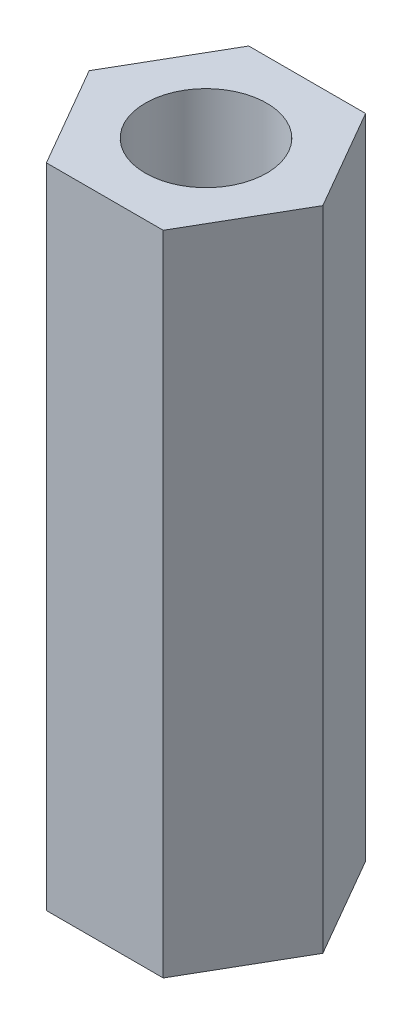
ISO-10303-21;
HEADER;
FILE_DESCRIPTION(('STEP AP214'),'2;1');
FILE_NAME('part.step','',(''),(''),'','','');
FILE_SCHEMA(('AUTOMOTIVE_DESIGN { 1 0 10303 214 1 1 1 1 }'));
ENDSEC;
DATA;
#1=APPLICATION_CONTEXT('core data for automotive mechanical design processes');
#2=APPLICATION_PROTOCOL_DEFINITION('international standard','automotive_design',2000,#1);
#3=PRODUCT_CONTEXT('',#1,'mechanical');
#4=PRODUCT('Part','Part','',(#3));
#5=PRODUCT_RELATED_PRODUCT_CATEGORY('part','',(#4));
#6=PRODUCT_DEFINITION_FORMATION('','',#4);
#7=PRODUCT_DEFINITION_CONTEXT('part definition',#1,'design');
#8=PRODUCT_DEFINITION('design','',#6,#7);
#9=PRODUCT_DEFINITION_SHAPE('','',#8);
#10=(LENGTH_UNIT() NAMED_UNIT(*) SI_UNIT(.MILLI.,.METRE.));
#11=(NAMED_UNIT(*) PLANE_ANGLE_UNIT() SI_UNIT($,.RADIAN.));
#12=(NAMED_UNIT(*) SI_UNIT($,.STERADIAN.) SOLID_ANGLE_UNIT());
#13=UNCERTAINTY_MEASURE_WITH_UNIT(LENGTH_MEASURE(1.E-05),#10,'distance_accuracy_value','');
#14=(GEOMETRIC_REPRESENTATION_CONTEXT(3) GLOBAL_UNCERTAINTY_ASSIGNED_CONTEXT((#13)) GLOBAL_UNIT_ASSIGNED_CONTEXT((#10,
#11,#12)) REPRESENTATION_CONTEXT('',''));
#15=CARTESIAN_POINT('',(0.,0.,0.));
#16=DIRECTION('',(0.,0.,1.));
#17=DIRECTION('',(1.,0.,0.));
#18=AXIS2_PLACEMENT_3D('',#15,#16,#17);
#19=CARTESIAN_POINT('',(0.,-6.,0.));
#20=DIRECTION('',(0.,1.,0.));
#21=DIRECTION('',(0.,0.,1.));
#22=AXIS2_PLACEMENT_3D('',#19,#20,#21);
#23=PLANE('',#22);
#24=DIRECTION('',(1.,0.,0.));
#25=VECTOR('',#24,1.);
#26=CARTESIAN_POINT('',(-1.44337567297405,-6.,2.5));
#27=LINE('',#26,#25);
#28=CARTESIAN_POINT('',(-1.44337567297405,-6.,2.5));
#29=VERTEX_POINT('',#28);
#30=CARTESIAN_POINT('',(1.44337567297408,-6.,2.5));
#31=VERTEX_POINT('',#30);
#32=EDGE_CURVE('E123',#29,#31,#27,.T.);
#33=ORIENTED_EDGE('',*,*,#32,.F.);
#34=DIRECTION('',(0.5,0.,0.866025403784438));
#35=VECTOR('',#34,1.);
#36=CARTESIAN_POINT('',(-2.88675134594812,-6.,0.));
#37=LINE('',#36,#35);
#38=CARTESIAN_POINT('',(-2.88675134594812,-6.,0.));
#39=VERTEX_POINT('',#38);
#40=EDGE_CURVE('E48',#39,#29,#37,.T.);
#41=ORIENTED_EDGE('',*,*,#40,.F.);
#42=DIRECTION('',(-0.5,0.,0.866025403784438));
#43=VECTOR('',#42,1.);
#44=CARTESIAN_POINT('',(-1.44337567297405,-6.,-2.50000000000001));
#45=LINE('',#44,#43);
#46=CARTESIAN_POINT('',(-1.44337567297405,-6.,-2.50000000000001));
#47=VERTEX_POINT('',#46);
#48=EDGE_CURVE('E56',#47,#39,#45,.T.);
#49=ORIENTED_EDGE('',*,*,#48,.F.);
#50=DIRECTION('',(-1.,0.,0.));
#51=VECTOR('',#50,1.);
#52=CARTESIAN_POINT('',(1.44337567297408,-6.,-2.50000000000001));
#53=LINE('',#52,#51);
#54=CARTESIAN_POINT('',(1.44337567297408,-6.,-2.50000000000001));
#55=VERTEX_POINT('',#54);
#56=EDGE_CURVE('E129',#55,#47,#53,.T.);
#57=ORIENTED_EDGE('',*,*,#56,.F.);
#58=DIRECTION('',(-0.500000000000001,0.,-0.866025403784438));
#59=VECTOR('',#58,1.);
#60=CARTESIAN_POINT('',(2.88675134594815,-6.,0.));
#61=LINE('',#60,#59);
#62=CARTESIAN_POINT('',(2.88675134594815,-6.,0.));
#63=VERTEX_POINT('',#62);
#64=EDGE_CURVE('E127',#63,#55,#61,.T.);
#65=ORIENTED_EDGE('',*,*,#64,.F.);
#66=DIRECTION('',(0.500000000000001,0.,-0.866025403784438));
#67=VECTOR('',#66,1.);
#68=CARTESIAN_POINT('',(1.44337567297408,-6.,2.5));
#69=LINE('',#68,#67);
#70=EDGE_CURVE('E125',#31,#63,#69,.T.);
#71=ORIENTED_EDGE('',*,*,#70,.F.);
#72=EDGE_LOOP('',(#33,#41,#49,#57,#65,#71));
#73=FACE_BOUND('',#72,.T.);
#74=CARTESIAN_POINT('',(0.,-6.,0.));
#75=DIRECTION('',(0.,1.,0.));
#76=DIRECTION('',(0.,0.,1.));
#77=AXIS2_PLACEMENT_3D('',#74,#75,#76);
#78=CIRCLE('',#77,1.5);
#79=CARTESIAN_POINT('',(0.,-6.,1.5));
#80=VERTEX_POINT('',#79);
#81=EDGE_CURVE('E120',#80,#80,#78,.T.);
#82=ORIENTED_EDGE('',*,*,#81,.T.);
#83=EDGE_LOOP('',(#82));
#84=FACE_BOUND('',#83,.T.);
#85=ADVANCED_FACE('F33',(#73,#84),#23,.F.);
#86=CARTESIAN_POINT('',(-1.44337567297405,6.,2.5));
#87=DIRECTION('',(0.,0.,-1.));
#88=DIRECTION('',(-1.,0.,0.));
#89=AXIS2_PLACEMENT_3D('',#86,#87,#88);
#90=PLANE('',#89);
#91=ORIENTED_EDGE('',*,*,#32,.T.);
#92=DIRECTION('',(0.,-1.,0.));
#93=VECTOR('',#92,1.);
#94=CARTESIAN_POINT('',(1.44337567297408,6.,2.5));
#95=LINE('',#94,#93);
#96=CARTESIAN_POINT('',(1.44337567297408,10.,2.5));
#97=VERTEX_POINT('',#96);
#98=EDGE_CURVE('E11',#97,#31,#95,.T.);
#99=ORIENTED_EDGE('',*,*,#98,.F.);
#100=DIRECTION('',(1.,0.,0.));
#101=VECTOR('',#100,1.);
#102=CARTESIAN_POINT('',(-1.44337567297405,10.,2.5));
#103=LINE('',#102,#101);
#104=CARTESIAN_POINT('',(-1.44337567297405,10.,2.5));
#105=VERTEX_POINT('',#104);
#106=EDGE_CURVE('E96',#105,#97,#103,.T.);
#107=ORIENTED_EDGE('',*,*,#106,.F.);
#108=DIRECTION('',(0.,-1.,0.));
#109=VECTOR('',#108,1.);
#110=CARTESIAN_POINT('',(-1.44337567297405,6.,2.5));
#111=LINE('',#110,#109);
#112=EDGE_CURVE('E85',#105,#29,#111,.T.);
#113=ORIENTED_EDGE('',*,*,#112,.T.);
#114=EDGE_LOOP('',(#91,#99,#107,#113));
#115=FACE_BOUND('',#114,.T.);
#116=ADVANCED_FACE('F35',(#115),#90,.F.);
#117=CARTESIAN_POINT('',(1.44337567297408,6.,2.5));
#118=DIRECTION('',(-0.866025403784438,0.,-0.500000000000001));
#119=DIRECTION('',(-0.500000000000001,0.,0.866025403784438));
#120=AXIS2_PLACEMENT_3D('',#117,#118,#119);
#121=PLANE('',#120);
#122=ORIENTED_EDGE('',*,*,#70,.T.);
#123=DIRECTION('',(0.,-1.,0.));
#124=VECTOR('',#123,1.);
#125=CARTESIAN_POINT('',(2.88675134594815,6.,0.));
#126=LINE('',#125,#124);
#127=CARTESIAN_POINT('',(2.88675134594815,10.,0.));
#128=VERTEX_POINT('',#127);
#129=EDGE_CURVE('E41',#128,#63,#126,.T.);
#130=ORIENTED_EDGE('',*,*,#129,.F.);
#131=DIRECTION('',(0.500000000000001,0.,-0.866025403784438));
#132=VECTOR('',#131,1.);
#133=CARTESIAN_POINT('',(1.44337567297408,10.,2.5));
#134=LINE('',#133,#132);
#135=EDGE_CURVE('E100',#97,#128,#134,.T.);
#136=ORIENTED_EDGE('',*,*,#135,.F.);
#137=ORIENTED_EDGE('',*,*,#98,.T.);
#138=EDGE_LOOP('',(#122,#130,#136,#137));
#139=FACE_BOUND('',#138,.T.);
#140=ADVANCED_FACE('F165',(#139),#121,.F.);
#141=CARTESIAN_POINT('',(2.88675134594815,6.,0.));
#142=DIRECTION('',(-0.866025403784438,0.,0.500000000000001));
#143=DIRECTION('',(0.500000000000001,0.,0.866025403784438));
#144=AXIS2_PLACEMENT_3D('',#141,#142,#143);
#145=PLANE('',#144);
#146=ORIENTED_EDGE('',*,*,#64,.T.);
#147=DIRECTION('',(0.,-1.,0.));
#148=VECTOR('',#147,1.);
#149=CARTESIAN_POINT('',(1.44337567297408,6.,-2.50000000000001));
#150=LINE('',#149,#148);
#151=CARTESIAN_POINT('',(1.44337567297408,10.,-2.50000000000001));
#152=VERTEX_POINT('',#151);
#153=EDGE_CURVE('E136',#152,#55,#150,.T.);
#154=ORIENTED_EDGE('',*,*,#153,.F.);
#155=DIRECTION('',(-0.500000000000001,0.,-0.866025403784438));
#156=VECTOR('',#155,1.);
#157=CARTESIAN_POINT('',(2.88675134594815,10.,0.));
#158=LINE('',#157,#156);
#159=EDGE_CURVE('E114',#128,#152,#158,.T.);
#160=ORIENTED_EDGE('',*,*,#159,.F.);
#161=ORIENTED_EDGE('',*,*,#129,.T.);
#162=EDGE_LOOP('',(#146,#154,#160,#161));
#163=FACE_BOUND('',#162,.T.);
#164=ADVANCED_FACE('F142',(#163),#145,.F.);
#165=CARTESIAN_POINT('',(1.44337567297408,6.,-2.50000000000001));
#166=DIRECTION('',(0.,0.,1.));
#167=DIRECTION('',(1.,0.,0.));
#168=AXIS2_PLACEMENT_3D('',#165,#166,#167);
#169=PLANE('',#168);
#170=ORIENTED_EDGE('',*,*,#56,.T.);
#171=DIRECTION('',(0.,-1.,0.));
#172=VECTOR('',#171,1.);
#173=CARTESIAN_POINT('',(-1.44337567297405,6.,-2.50000000000001));
#174=LINE('',#173,#172);
#175=CARTESIAN_POINT('',(-1.44337567297405,10.,-2.50000000000001));
#176=VERTEX_POINT('',#175);
#177=EDGE_CURVE('E134',#176,#47,#174,.T.);
#178=ORIENTED_EDGE('',*,*,#177,.F.);
#179=DIRECTION('',(-1.,0.,0.));
#180=VECTOR('',#179,1.);
#181=CARTESIAN_POINT('',(1.44337567297408,10.,-2.50000000000001));
#182=LINE('',#181,#180);
#183=EDGE_CURVE('E117',#152,#176,#182,.T.);
#184=ORIENTED_EDGE('',*,*,#183,.F.);
#185=ORIENTED_EDGE('',*,*,#153,.T.);
#186=EDGE_LOOP('',(#170,#178,#184,#185));
#187=FACE_BOUND('',#186,.T.);
#188=ADVANCED_FACE('F148',(#187),#169,.F.);
#189=CARTESIAN_POINT('',(-1.44337567297405,6.,-2.50000000000001));
#190=DIRECTION('',(0.866025403784439,0.,0.5));
#191=DIRECTION('',(0.5,0.,-0.866025403784439));
#192=AXIS2_PLACEMENT_3D('',#189,#190,#191);
#193=PLANE('',#192);
#194=ORIENTED_EDGE('',*,*,#48,.T.);
#195=DIRECTION('',(0.,-1.,0.));
#196=VECTOR('',#195,1.);
#197=CARTESIAN_POINT('',(-2.88675134594812,6.,0.));
#198=LINE('',#197,#196);
#199=CARTESIAN_POINT('',(-2.88675134594812,10.,0.));
#200=VERTEX_POINT('',#199);
#201=EDGE_CURVE('E93',#200,#39,#198,.T.);
#202=ORIENTED_EDGE('',*,*,#201,.F.);
#203=DIRECTION('',(-0.5,0.,0.866025403784438));
#204=VECTOR('',#203,1.);
#205=CARTESIAN_POINT('',(-1.44337567297405,10.,-2.50000000000001));
#206=LINE('',#205,#204);
#207=EDGE_CURVE('E107',#176,#200,#206,.T.);
#208=ORIENTED_EDGE('',*,*,#207,.F.);
#209=ORIENTED_EDGE('',*,*,#177,.T.);
#210=EDGE_LOOP('',(#194,#202,#208,#209));
#211=FACE_BOUND('',#210,.T.);
#212=ADVANCED_FACE('F150',(#211),#193,.F.);
#213=CARTESIAN_POINT('',(-2.88675134594812,6.,0.));
#214=DIRECTION('',(0.866025403784438,0.,-0.500000000000001));
#215=DIRECTION('',(-0.500000000000001,0.,-0.866025403784438));
#216=AXIS2_PLACEMENT_3D('',#213,#214,#215);
#217=PLANE('',#216);
#218=ORIENTED_EDGE('',*,*,#40,.T.);
#219=ORIENTED_EDGE('',*,*,#112,.F.);
#220=DIRECTION('',(0.5,0.,0.866025403784438));
#221=VECTOR('',#220,1.);
#222=CARTESIAN_POINT('',(-2.88675134594812,10.,0.));
#223=LINE('',#222,#221);
#224=EDGE_CURVE('E89',#200,#105,#223,.T.);
#225=ORIENTED_EDGE('',*,*,#224,.F.);
#226=ORIENTED_EDGE('',*,*,#201,.T.);
#227=EDGE_LOOP('',(#218,#219,#225,#226));
#228=FACE_BOUND('',#227,.T.);
#229=ADVANCED_FACE('F87',(#228),#217,.F.);
#230=CARTESIAN_POINT('',(0.,6.,0.));
#231=DIRECTION('',(0.,-1.,0.));
#232=DIRECTION('',(0.,0.,-1.));
#233=AXIS2_PLACEMENT_3D('',#230,#231,#232);
#234=CYLINDRICAL_SURFACE('',#233,1.5);
#235=ORIENTED_EDGE('',*,*,#81,.F.);
#236=EDGE_LOOP('',(#235));
#237=FACE_BOUND('',#236,.T.);
#238=CARTESIAN_POINT('',(0.,10.,0.));
#239=DIRECTION('',(0.,1.,0.));
#240=DIRECTION('',(0.,0.,1.));
#241=AXIS2_PLACEMENT_3D('',#238,#239,#240);
#242=CIRCLE('',#241,1.5);
#243=CARTESIAN_POINT('',(0.,10.,1.5));
#244=VERTEX_POINT('',#243);
#245=EDGE_CURVE('E108',#244,#244,#242,.T.);
#246=ORIENTED_EDGE('',*,*,#245,.T.);
#247=EDGE_LOOP('',(#246));
#248=FACE_BOUND('',#247,.T.);
#249=ADVANCED_FACE('F157',(#237,#248),#234,.F.);
#250=CARTESIAN_POINT('',(0.,10.,0.));
#251=DIRECTION('',(0.,1.,0.));
#252=DIRECTION('',(0.,0.,1.));
#253=AXIS2_PLACEMENT_3D('',#250,#251,#252);
#254=PLANE('',#253);
#255=ORIENTED_EDGE('',*,*,#224,.T.);
#256=ORIENTED_EDGE('',*,*,#106,.T.);
#257=ORIENTED_EDGE('',*,*,#135,.T.);
#258=ORIENTED_EDGE('',*,*,#159,.T.);
#259=ORIENTED_EDGE('',*,*,#183,.T.);
#260=ORIENTED_EDGE('',*,*,#207,.T.);
#261=EDGE_LOOP('',(#255,#256,#257,#258,#259,#260));
#262=FACE_BOUND('',#261,.T.);
#263=ORIENTED_EDGE('',*,*,#245,.F.);
#264=EDGE_LOOP('',(#263));
#265=FACE_BOUND('',#264,.T.);
#266=ADVANCED_FACE('F103',(#262,#265),#254,.T.);
#267=CLOSED_SHELL('',(#85,#116,#140,#164,#188,#212,#229,#249,#266));
#268=MANIFOLD_SOLID_BREP('B2',#267);
#269=ADVANCED_BREP_SHAPE_REPRESENTATION('',(#18,#268),#14);
#270=SHAPE_DEFINITION_REPRESENTATION(#9,#269);
ENDSEC;
END-ISO-10303-21;
